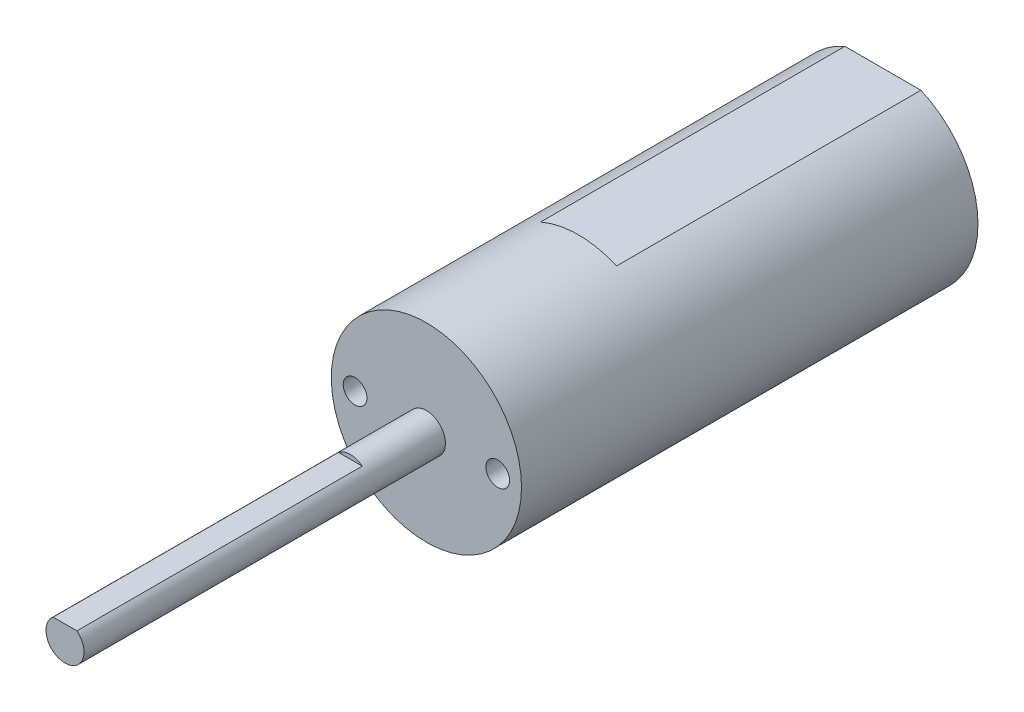
ISO-10303-21;
HEADER;
FILE_DESCRIPTION(('STEP AP214'),'2;1');
FILE_NAME('part.step','',(''),(''),'','','');
FILE_SCHEMA(('AUTOMOTIVE_DESIGN { 1 0 10303 214 1 1 1 1 }'));
ENDSEC;
DATA;
#1=APPLICATION_CONTEXT('core data for automotive mechanical design processes');
#2=APPLICATION_PROTOCOL_DEFINITION('international standard','automotive_design',2000,#1);
#3=PRODUCT_CONTEXT('',#1,'mechanical');
#4=PRODUCT('Part','Part','',(#3));
#5=PRODUCT_RELATED_PRODUCT_CATEGORY('part','',(#4));
#6=PRODUCT_DEFINITION_FORMATION('','',#4);
#7=PRODUCT_DEFINITION_CONTEXT('part definition',#1,'design');
#8=PRODUCT_DEFINITION('design','',#6,#7);
#9=PRODUCT_DEFINITION_SHAPE('','',#8);
#10=(LENGTH_UNIT() NAMED_UNIT(*) SI_UNIT(.MILLI.,.METRE.));
#11=(NAMED_UNIT(*) PLANE_ANGLE_UNIT() SI_UNIT($,.RADIAN.));
#12=(NAMED_UNIT(*) SI_UNIT($,.STERADIAN.) SOLID_ANGLE_UNIT());
#13=UNCERTAINTY_MEASURE_WITH_UNIT(LENGTH_MEASURE(1.E-05),#10,'distance_accuracy_value','');
#14=(GEOMETRIC_REPRESENTATION_CONTEXT(3) GLOBAL_UNCERTAINTY_ASSIGNED_CONTEXT((#13)) GLOBAL_UNIT_ASSIGNED_CONTEXT((#10,
#11,#12)) REPRESENTATION_CONTEXT('',''));
#15=CARTESIAN_POINT('',(0.,0.,0.));
#16=DIRECTION('',(0.,0.,1.));
#17=DIRECTION('',(1.,0.,0.));
#18=AXIS2_PLACEMENT_3D('',#15,#16,#17);
#19=CARTESIAN_POINT('',(0.,0.,86.));
#20=DIRECTION('',(0.,0.,-1.));
#21=DIRECTION('',(-1.,0.,0.));
#22=AXIS2_PLACEMENT_3D('',#19,#20,#21);
#23=CYLINDRICAL_SURFACE('',#22,2.);
#24=CARTESIAN_POINT('',(0.,0.,48.));
#25=DIRECTION('',(0.,0.,1.));
#26=DIRECTION('',(1.,0.,0.));
#27=AXIS2_PLACEMENT_3D('',#24,#25,#26);
#28=CIRCLE('',#27,2.);
#29=CARTESIAN_POINT('',(2.,0.,48.));
#30=VERTEX_POINT('',#29);
#31=EDGE_CURVE('E116',#30,#30,#28,.T.);
#32=ORIENTED_EDGE('',*,*,#31,.T.);
#33=EDGE_LOOP('',(#32));
#34=FACE_BOUND('',#33,.T.);
#35=DIRECTION('',(0.,0.,1.));
#36=VECTOR('',#35,1.);
#37=CARTESIAN_POINT('',(1.25,1.5612494995996,56.));
#38=LINE('',#37,#36);
#39=CARTESIAN_POINT('',(1.25,1.5612494995996,56.));
#40=VERTEX_POINT('',#39);
#41=CARTESIAN_POINT('',(1.25,1.5612494995996,86.));
#42=VERTEX_POINT('',#41);
#43=EDGE_CURVE('E93',#40,#42,#38,.T.);
#44=ORIENTED_EDGE('',*,*,#43,.T.);
#45=CARTESIAN_POINT('',(0.,0.,86.));
#46=DIRECTION('',(0.,0.,1.));
#47=DIRECTION('',(1.,0.,0.));
#48=AXIS2_PLACEMENT_3D('',#45,#46,#47);
#49=CIRCLE('',#48,2.);
#50=CARTESIAN_POINT('',(-1.25,1.5612494995996,86.));
#51=VERTEX_POINT('',#50);
#52=EDGE_CURVE('E118',#51,#42,#49,.T.);
#53=ORIENTED_EDGE('',*,*,#52,.F.);
#54=DIRECTION('',(0.,0.,1.));
#55=VECTOR('',#54,1.);
#56=CARTESIAN_POINT('',(-1.25,1.5612494995996,56.));
#57=LINE('',#56,#55);
#58=CARTESIAN_POINT('',(-1.25,1.5612494995996,56.));
#59=VERTEX_POINT('',#58);
#60=EDGE_CURVE('E57',#59,#51,#57,.T.);
#61=ORIENTED_EDGE('',*,*,#60,.F.);
#62=CARTESIAN_POINT('',(0.,0.,56.));
#63=DIRECTION('',(0.,0.,1.));
#64=DIRECTION('',(1.,0.,0.));
#65=AXIS2_PLACEMENT_3D('',#62,#63,#64);
#66=CIRCLE('',#65,2.);
#67=EDGE_CURVE('E104',#40,#59,#66,.T.);
#68=ORIENTED_EDGE('',*,*,#67,.F.);
#69=EDGE_LOOP('',(#44,#53,#61,#68));
#70=FACE_BOUND('',#69,.T.);
#71=ADVANCED_FACE('F41',(#34,#70),#23,.T.);
#72=CARTESIAN_POINT('',(0.,0.,86.));
#73=DIRECTION('',(0.,0.,1.));
#74=DIRECTION('',(1.,0.,0.));
#75=AXIS2_PLACEMENT_3D('',#72,#73,#74);
#76=PLANE('',#75);
#77=ORIENTED_EDGE('',*,*,#52,.T.);
#78=DIRECTION('',(-1.,0.,0.));
#79=VECTOR('',#78,1.);
#80=CARTESIAN_POINT('',(0.,1.5612494995996,86.));
#81=LINE('',#80,#79);
#82=EDGE_CURVE('E98',#42,#51,#81,.T.);
#83=ORIENTED_EDGE('',*,*,#82,.T.);
#84=EDGE_LOOP('',(#77,#83));
#85=FACE_BOUND('',#84,.T.);
#86=ADVANCED_FACE('F204',(#85),#76,.T.);
#87=CARTESIAN_POINT('',(0.,0.,32.));
#88=DIRECTION('',(0.,0.,-1.));
#89=DIRECTION('',(-1.,0.,0.));
#90=AXIS2_PLACEMENT_3D('',#87,#88,#89);
#91=CYLINDRICAL_SURFACE('',#90,10.);
#92=CARTESIAN_POINT('',(0.,0.,0.));
#93=DIRECTION('',(0.,0.,1.));
#94=DIRECTION('',(1.,0.,0.));
#95=AXIS2_PLACEMENT_3D('',#92,#93,#94);
#96=CIRCLE('',#95,10.);
#97=CARTESIAN_POINT('',(4.,-9.16515138991168,0.));
#98=VERTEX_POINT('',#97);
#99=CARTESIAN_POINT('',(4.,9.16515138991168,0.));
#100=VERTEX_POINT('',#99);
#101=EDGE_CURVE('E45',#98,#100,#96,.T.);
#102=ORIENTED_EDGE('',*,*,#101,.T.);
#103=DIRECTION('',(0.,0.,-1.));
#104=VECTOR('',#103,1.);
#105=CARTESIAN_POINT('',(4.,9.16515138991168,32.));
#106=LINE('',#105,#104);
#107=CARTESIAN_POINT('',(4.,9.16515138991168,32.));
#108=VERTEX_POINT('',#107);
#109=EDGE_CURVE('E154',#108,#100,#106,.T.);
#110=ORIENTED_EDGE('',*,*,#109,.F.);
#111=CARTESIAN_POINT('',(0.,0.,32.));
#112=DIRECTION('',(0.,0.,1.));
#113=DIRECTION('',(1.,0.,0.));
#114=AXIS2_PLACEMENT_3D('',#111,#112,#113);
#115=CIRCLE('',#114,10.);
#116=CARTESIAN_POINT('',(-4.,9.16515138991168,32.));
#117=VERTEX_POINT('',#116);
#118=EDGE_CURVE('E146',#108,#117,#115,.T.);
#119=ORIENTED_EDGE('',*,*,#118,.T.);
#120=DIRECTION('',(0.,0.,-1.));
#121=VECTOR('',#120,1.);
#122=CARTESIAN_POINT('',(-4.,9.16515138991168,32.));
#123=LINE('',#122,#121);
#124=CARTESIAN_POINT('',(-4.,9.16515138991168,0.));
#125=VERTEX_POINT('',#124);
#126=EDGE_CURVE('E159',#117,#125,#123,.T.);
#127=ORIENTED_EDGE('',*,*,#126,.T.);
#128=CARTESIAN_POINT('',(-4.,-9.16515138991168,0.));
#129=VERTEX_POINT('',#128);
#130=EDGE_CURVE('E11',#125,#129,#96,.T.);
#131=ORIENTED_EDGE('',*,*,#130,.T.);
#132=DIRECTION('',(0.,0.,-1.));
#133=VECTOR('',#132,1.);
#134=CARTESIAN_POINT('',(-4.,-9.16515138991168,32.));
#135=LINE('',#134,#133);
#136=CARTESIAN_POINT('',(-4.,-9.16515138991168,32.));
#137=VERTEX_POINT('',#136);
#138=EDGE_CURVE('E65',#137,#129,#135,.T.);
#139=ORIENTED_EDGE('',*,*,#138,.F.);
#140=CARTESIAN_POINT('',(4.,-9.16515138991168,32.));
#141=VERTEX_POINT('',#140);
#142=EDGE_CURVE('E129',#137,#141,#115,.T.);
#143=ORIENTED_EDGE('',*,*,#142,.T.);
#144=DIRECTION('',(0.,0.,-1.));
#145=VECTOR('',#144,1.);
#146=CARTESIAN_POINT('',(4.,-9.16515138991168,32.));
#147=LINE('',#146,#145);
#148=EDGE_CURVE('E158',#141,#98,#147,.T.);
#149=ORIENTED_EDGE('',*,*,#148,.T.);
#150=EDGE_LOOP('',(#102,#110,#119,#127,#131,#139,#143,#149));
#151=FACE_BOUND('',#150,.T.);
#152=CARTESIAN_POINT('',(0.,0.,48.));
#153=DIRECTION('',(0.,0.,1.));
#154=DIRECTION('',(1.,0.,0.));
#155=AXIS2_PLACEMENT_3D('',#152,#153,#154);
#156=CIRCLE('',#155,10.);
#157=CARTESIAN_POINT('',(10.,0.,48.));
#158=VERTEX_POINT('',#157);
#159=EDGE_CURVE('E141',#158,#158,#156,.T.);
#160=ORIENTED_EDGE('',*,*,#159,.F.);
#161=EDGE_LOOP('',(#160));
#162=FACE_BOUND('',#161,.T.);
#163=ADVANCED_FACE('F43',(#151,#162),#91,.T.);
#164=CARTESIAN_POINT('',(0.,0.,0.));
#165=DIRECTION('',(0.,0.,1.));
#166=DIRECTION('',(1.,0.,0.));
#167=AXIS2_PLACEMENT_3D('',#164,#165,#166);
#168=PLANE('',#167);
#169=ORIENTED_EDGE('',*,*,#130,.F.);
#170=DIRECTION('',(-1.,0.,0.));
#171=VECTOR('',#170,1.);
#172=CARTESIAN_POINT('',(0.,9.16515138991168,0.));
#173=LINE('',#172,#171);
#174=EDGE_CURVE('E155',#100,#125,#173,.T.);
#175=ORIENTED_EDGE('',*,*,#174,.F.);
#176=ORIENTED_EDGE('',*,*,#101,.F.);
#177=DIRECTION('',(1.,0.,0.));
#178=VECTOR('',#177,1.);
#179=CARTESIAN_POINT('',(0.,-9.16515138991168,0.));
#180=LINE('',#179,#178);
#181=EDGE_CURVE('E145',#129,#98,#180,.T.);
#182=ORIENTED_EDGE('',*,*,#181,.F.);
#183=EDGE_LOOP('',(#169,#175,#176,#182));
#184=FACE_BOUND('',#183,.T.);
#185=ADVANCED_FACE('F186',(#184),#168,.F.);
#186=CARTESIAN_POINT('',(0.,-9.16515138991168,32.));
#187=DIRECTION('',(0.,1.,0.));
#188=DIRECTION('',(0.,0.,1.));
#189=AXIS2_PLACEMENT_3D('',#186,#187,#188);
#190=PLANE('',#189);
#191=ORIENTED_EDGE('',*,*,#181,.T.);
#192=ORIENTED_EDGE('',*,*,#148,.F.);
#193=DIRECTION('',(1.,0.,0.));
#194=VECTOR('',#193,1.);
#195=CARTESIAN_POINT('',(0.,-9.16515138991168,32.));
#196=LINE('',#195,#194);
#197=EDGE_CURVE('E165',#137,#141,#196,.T.);
#198=ORIENTED_EDGE('',*,*,#197,.F.);
#199=ORIENTED_EDGE('',*,*,#138,.T.);
#200=EDGE_LOOP('',(#191,#192,#198,#199));
#201=FACE_BOUND('',#200,.T.);
#202=ADVANCED_FACE('F183',(#201),#190,.F.);
#203=CARTESIAN_POINT('',(0.,9.16515138991168,32.));
#204=DIRECTION('',(0.,-1.,0.));
#205=DIRECTION('',(0.,0.,-1.));
#206=AXIS2_PLACEMENT_3D('',#203,#204,#205);
#207=PLANE('',#206);
#208=ORIENTED_EDGE('',*,*,#174,.T.);
#209=ORIENTED_EDGE('',*,*,#126,.F.);
#210=DIRECTION('',(-1.,0.,0.));
#211=VECTOR('',#210,1.);
#212=CARTESIAN_POINT('',(0.,9.16515138991168,32.));
#213=LINE('',#212,#211);
#214=EDGE_CURVE('E150',#108,#117,#213,.T.);
#215=ORIENTED_EDGE('',*,*,#214,.F.);
#216=ORIENTED_EDGE('',*,*,#109,.T.);
#217=EDGE_LOOP('',(#208,#209,#215,#216));
#218=FACE_BOUND('',#217,.T.);
#219=ADVANCED_FACE('F191',(#218),#207,.F.);
#220=CARTESIAN_POINT('',(0.,0.,32.));
#221=DIRECTION('',(0.,0.,1.));
#222=DIRECTION('',(1.,0.,0.));
#223=AXIS2_PLACEMENT_3D('',#220,#221,#222);
#224=PLANE('',#223);
#225=ORIENTED_EDGE('',*,*,#118,.F.);
#226=ORIENTED_EDGE('',*,*,#214,.T.);
#227=EDGE_LOOP('',(#225,#226));
#228=FACE_BOUND('',#227,.T.);
#229=ADVANCED_FACE('F193',(#228),#224,.F.);
#230=ORIENTED_EDGE('',*,*,#142,.F.);
#231=ORIENTED_EDGE('',*,*,#197,.T.);
#232=EDGE_LOOP('',(#230,#231));
#233=FACE_BOUND('',#232,.T.);
#234=ADVANCED_FACE('F182',(#233),#224,.F.);
#235=CARTESIAN_POINT('',(0.,0.,48.));
#236=DIRECTION('',(0.,0.,1.));
#237=DIRECTION('',(1.,0.,0.));
#238=AXIS2_PLACEMENT_3D('',#235,#236,#237);
#239=PLANE('',#238);
#240=ORIENTED_EDGE('',*,*,#31,.F.);
#241=EDGE_LOOP('',(#240));
#242=FACE_BOUND('',#241,.T.);
#243=CARTESIAN_POINT('',(7.5,0.,48.));
#244=DIRECTION('',(0.,0.,1.));
#245=DIRECTION('',(1.,0.,0.));
#246=AXIS2_PLACEMENT_3D('',#243,#244,#245);
#247=CIRCLE('',#246,1.25);
#248=CARTESIAN_POINT('',(8.75,0.,48.));
#249=VERTEX_POINT('',#248);
#250=EDGE_CURVE('E130',#249,#249,#247,.T.);
#251=ORIENTED_EDGE('',*,*,#250,.F.);
#252=EDGE_LOOP('',(#251));
#253=FACE_BOUND('',#252,.T.);
#254=CARTESIAN_POINT('',(-7.5,0.,48.));
#255=DIRECTION('',(0.,0.,1.));
#256=DIRECTION('',(1.,0.,0.));
#257=AXIS2_PLACEMENT_3D('',#254,#255,#256);
#258=CIRCLE('',#257,1.25);
#259=CARTESIAN_POINT('',(-6.25,0.,48.));
#260=VERTEX_POINT('',#259);
#261=EDGE_CURVE('E134',#260,#260,#258,.T.);
#262=ORIENTED_EDGE('',*,*,#261,.F.);
#263=EDGE_LOOP('',(#262));
#264=FACE_BOUND('',#263,.T.);
#265=ORIENTED_EDGE('',*,*,#159,.T.);
#266=EDGE_LOOP('',(#265));
#267=FACE_BOUND('',#266,.T.);
#268=ADVANCED_FACE('F200',(#242,#253,#264,#267),#239,.T.);
#269=CARTESIAN_POINT('',(-7.5,0.,42.));
#270=DIRECTION('',(0.,0.,1.));
#271=DIRECTION('',(1.,0.,0.));
#272=AXIS2_PLACEMENT_3D('',#269,#270,#271);
#273=CYLINDRICAL_SURFACE('',#272,1.25);
#274=CARTESIAN_POINT('',(-7.5,0.,42.));
#275=DIRECTION('',(0.,0.,1.));
#276=DIRECTION('',(1.,0.,0.));
#277=AXIS2_PLACEMENT_3D('',#274,#275,#276);
#278=CIRCLE('',#277,1.25);
#279=CARTESIAN_POINT('',(-6.25,0.,42.));
#280=VERTEX_POINT('',#279);
#281=EDGE_CURVE('E121',#280,#280,#278,.T.);
#282=ORIENTED_EDGE('',*,*,#281,.F.);
#283=EDGE_LOOP('',(#282));
#284=FACE_BOUND('',#283,.T.);
#285=ORIENTED_EDGE('',*,*,#261,.T.);
#286=EDGE_LOOP('',(#285));
#287=FACE_BOUND('',#286,.T.);
#288=ADVANCED_FACE('F223',(#284,#287),#273,.F.);
#289=CARTESIAN_POINT('',(-7.5,0.,42.));
#290=DIRECTION('',(0.,0.,1.));
#291=DIRECTION('',(1.,0.,0.));
#292=AXIS2_PLACEMENT_3D('',#289,#290,#291);
#293=PLANE('',#292);
#294=ORIENTED_EDGE('',*,*,#281,.T.);
#295=EDGE_LOOP('',(#294));
#296=FACE_BOUND('',#295,.T.);
#297=ADVANCED_FACE('F221',(#296),#293,.T.);
#298=CARTESIAN_POINT('',(7.5,0.,42.));
#299=DIRECTION('',(0.,0.,1.));
#300=DIRECTION('',(1.,0.,0.));
#301=AXIS2_PLACEMENT_3D('',#298,#299,#300);
#302=CYLINDRICAL_SURFACE('',#301,1.25);
#303=CARTESIAN_POINT('',(7.5,0.,42.));
#304=DIRECTION('',(0.,0.,1.));
#305=DIRECTION('',(1.,0.,0.));
#306=AXIS2_PLACEMENT_3D('',#303,#304,#305);
#307=CIRCLE('',#306,1.25);
#308=CARTESIAN_POINT('',(8.75,0.,42.));
#309=VERTEX_POINT('',#308);
#310=EDGE_CURVE('E125',#309,#309,#307,.T.);
#311=ORIENTED_EDGE('',*,*,#310,.F.);
#312=EDGE_LOOP('',(#311));
#313=FACE_BOUND('',#312,.T.);
#314=ORIENTED_EDGE('',*,*,#250,.T.);
#315=EDGE_LOOP('',(#314));
#316=FACE_BOUND('',#315,.T.);
#317=ADVANCED_FACE('F217',(#313,#316),#302,.F.);
#318=CARTESIAN_POINT('',(7.5,0.,42.));
#319=DIRECTION('',(0.,0.,1.));
#320=DIRECTION('',(1.,0.,0.));
#321=AXIS2_PLACEMENT_3D('',#318,#319,#320);
#322=PLANE('',#321);
#323=ORIENTED_EDGE('',*,*,#310,.T.);
#324=EDGE_LOOP('',(#323));
#325=FACE_BOUND('',#324,.T.);
#326=ADVANCED_FACE('F214',(#325),#322,.T.);
#327=CARTESIAN_POINT('',(0.,1.5612494995996,56.));
#328=DIRECTION('',(0.,1.,0.));
#329=DIRECTION('',(0.,0.,1.));
#330=AXIS2_PLACEMENT_3D('',#327,#328,#329);
#331=PLANE('',#330);
#332=ORIENTED_EDGE('',*,*,#82,.F.);
#333=ORIENTED_EDGE('',*,*,#43,.F.);
#334=DIRECTION('',(-1.,0.,0.));
#335=VECTOR('',#334,1.);
#336=CARTESIAN_POINT('',(0.,1.5612494995996,56.));
#337=LINE('',#336,#335);
#338=EDGE_CURVE('E96',#40,#59,#337,.T.);
#339=ORIENTED_EDGE('',*,*,#338,.T.);
#340=ORIENTED_EDGE('',*,*,#60,.T.);
#341=EDGE_LOOP('',(#332,#333,#339,#340));
#342=FACE_BOUND('',#341,.T.);
#343=ADVANCED_FACE('F95',(#342),#331,.T.);
#344=CARTESIAN_POINT('',(0.,0.,56.));
#345=DIRECTION('',(0.,0.,1.));
#346=DIRECTION('',(1.,0.,0.));
#347=AXIS2_PLACEMENT_3D('',#344,#345,#346);
#348=PLANE('',#347);
#349=ORIENTED_EDGE('',*,*,#338,.F.);
#350=ORIENTED_EDGE('',*,*,#67,.T.);
#351=EDGE_LOOP('',(#349,#350));
#352=FACE_BOUND('',#351,.T.);
#353=ADVANCED_FACE('F107',(#352),#348,.T.);
#354=CLOSED_SHELL('',(#71,#86,#163,#185,#202,#219,#229,#234,#268,#288,#297,#317,#326,#343,#353));
#355=MANIFOLD_SOLID_BREP('B2',#354);
#356=ADVANCED_BREP_SHAPE_REPRESENTATION('',(#18,#355),#14);
#357=SHAPE_DEFINITION_REPRESENTATION(#9,#356);
ENDSEC;
END-ISO-10303-21;
